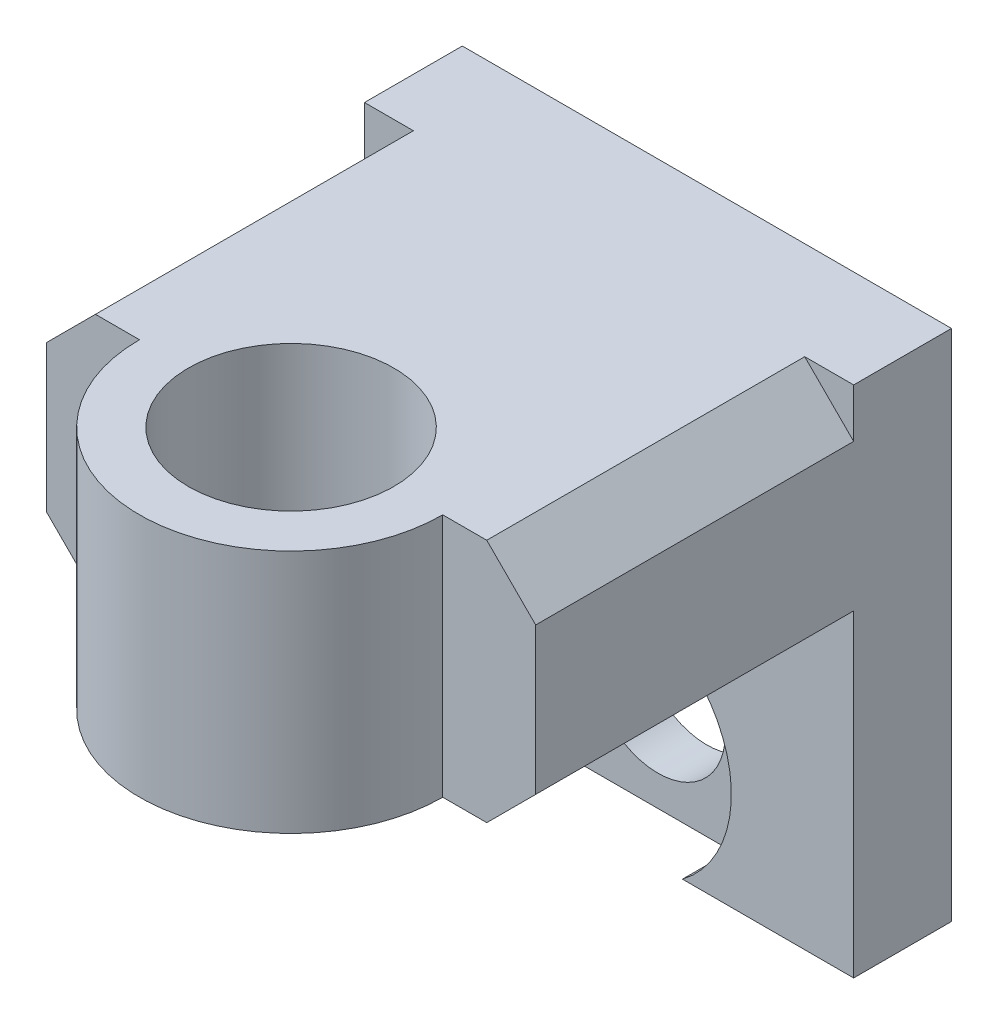
ISO-10303-21;
HEADER;
FILE_DESCRIPTION(('STEP AP214'),'2;1');
FILE_NAME('part.step','',(''),(''),'','','');
FILE_SCHEMA(('AUTOMOTIVE_DESIGN { 1 0 10303 214 1 1 1 1 }'));
ENDSEC;
DATA;
#1=APPLICATION_CONTEXT('core data for automotive mechanical design processes');
#2=APPLICATION_PROTOCOL_DEFINITION('international standard','automotive_design',2000,#1);
#3=PRODUCT_CONTEXT('',#1,'mechanical');
#4=PRODUCT('Part','Part','',(#3));
#5=PRODUCT_RELATED_PRODUCT_CATEGORY('part','',(#4));
#6=PRODUCT_DEFINITION_FORMATION('','',#4);
#7=PRODUCT_DEFINITION_CONTEXT('part definition',#1,'design');
#8=PRODUCT_DEFINITION('design','',#6,#7);
#9=PRODUCT_DEFINITION_SHAPE('','',#8);
#10=(LENGTH_UNIT() NAMED_UNIT(*) SI_UNIT(.MILLI.,.METRE.));
#11=(NAMED_UNIT(*) PLANE_ANGLE_UNIT() SI_UNIT($,.RADIAN.));
#12=(NAMED_UNIT(*) SI_UNIT($,.STERADIAN.) SOLID_ANGLE_UNIT());
#13=UNCERTAINTY_MEASURE_WITH_UNIT(LENGTH_MEASURE(1.E-05),#10,'distance_accuracy_value','');
#14=(GEOMETRIC_REPRESENTATION_CONTEXT(3) GLOBAL_UNCERTAINTY_ASSIGNED_CONTEXT((#13)) GLOBAL_UNIT_ASSIGNED_CONTEXT((#10,
#11,#12)) REPRESENTATION_CONTEXT('',''));
#15=CARTESIAN_POINT('',(0.,0.,0.));
#16=DIRECTION('',(0.,0.,1.));
#17=DIRECTION('',(1.,0.,0.));
#18=AXIS2_PLACEMENT_3D('',#15,#16,#17);
#19=CARTESIAN_POINT('',(0.,0.,4.));
#20=DIRECTION('',(0.,0.,1.));
#21=DIRECTION('',(1.,0.,0.));
#22=AXIS2_PLACEMENT_3D('',#19,#20,#21);
#23=PLANE('',#22);
#24=DIRECTION('',(1.,0.,0.));
#25=VECTOR('',#24,1.);
#26=CARTESIAN_POINT('',(0.,-11.,4.));
#27=LINE('',#26,#25);
#28=CARTESIAN_POINT('',(0.,-11.,4.));
#29=VERTEX_POINT('',#28);
#30=CARTESIAN_POINT('',(2.00000000000001,-11.,4.));
#31=VERTEX_POINT('',#30);
#32=EDGE_CURVE('E159',#29,#31,#27,.T.);
#33=ORIENTED_EDGE('',*,*,#32,.F.);
#34=DIRECTION('',(0.,-1.,0.));
#35=VECTOR('',#34,1.);
#36=CARTESIAN_POINT('',(0.,0.,4.));
#37=LINE('',#36,#35);
#38=CARTESIAN_POINT('',(0.,-13.,4.));
#39=VERTEX_POINT('',#38);
#40=EDGE_CURVE('E166',#29,#39,#37,.T.);
#41=ORIENTED_EDGE('',*,*,#40,.T.);
#42=DIRECTION('',(-0.707106781186549,-0.707106781186546,0.));
#43=VECTOR('',#42,1.);
#44=CARTESIAN_POINT('',(0.,-13.,4.));
#45=LINE('',#44,#43);
#46=EDGE_CURVE('E229',#39,#31,#45,.F.);
#47=ORIENTED_EDGE('',*,*,#46,.T.);
#48=EDGE_LOOP('',(#33,#41,#47));
#49=FACE_BOUND('',#48,.T.);
#50=ADVANCED_FACE('F35',(#49),#23,.T.);
#51=CARTESIAN_POINT('',(10.,-28.,4.));
#52=DIRECTION('',(0.,0.,-1.));
#53=DIRECTION('',(-1.,0.,0.));
#54=AXIS2_PLACEMENT_3D('',#51,#52,#53);
#55=CYLINDRICAL_SURFACE('',#54,2.75);
#56=CARTESIAN_POINT('',(10.,-28.,0.));
#57=DIRECTION('',(0.,0.,1.));
#58=DIRECTION('',(1.,0.,0.));
#59=AXIS2_PLACEMENT_3D('',#56,#57,#58);
#60=CIRCLE('',#59,2.75);
#61=CARTESIAN_POINT('',(12.75,-28.,0.));
#62=VERTEX_POINT('',#61);
#63=EDGE_CURVE('E172',#62,#62,#60,.T.);
#64=ORIENTED_EDGE('',*,*,#63,.F.);
#65=EDGE_LOOP('',(#64));
#66=FACE_BOUND('',#65,.T.);
#67=CARTESIAN_POINT('',(10.,-28.,2.));
#68=DIRECTION('',(0.,0.,1.));
#69=DIRECTION('',(1.,0.,0.));
#70=AXIS2_PLACEMENT_3D('',#67,#68,#69);
#71=CIRCLE('',#70,2.75);
#72=CARTESIAN_POINT('',(12.75,-28.,2.));
#73=VERTEX_POINT('',#72);
#74=EDGE_CURVE('E232',#73,#73,#71,.T.);
#75=ORIENTED_EDGE('',*,*,#74,.T.);
#76=EDGE_LOOP('',(#75));
#77=FACE_BOUND('',#76,.T.);
#78=ADVANCED_FACE('F332',(#66,#77),#55,.F.);
#79=CARTESIAN_POINT('',(0.,0.,17.));
#80=DIRECTION('',(0.,0.,1.));
#81=DIRECTION('',(1.,0.,0.));
#82=AXIS2_PLACEMENT_3D('',#79,#80,#81);
#83=PLANE('',#82);
#84=DIRECTION('',(0.,-1.,0.));
#85=VECTOR('',#84,1.);
#86=CARTESIAN_POINT('',(0.,-11.,17.));
#87=LINE('',#86,#85);
#88=CARTESIAN_POINT('',(0.,-13.,17.));
#89=VERTEX_POINT('',#88);
#90=CARTESIAN_POINT('',(0.,-19.,17.));
#91=VERTEX_POINT('',#90);
#92=EDGE_CURVE('E269',#89,#91,#87,.T.);
#93=ORIENTED_EDGE('',*,*,#92,.T.);
#94=DIRECTION('',(-0.707106781186549,0.707106781186546,0.));
#95=VECTOR('',#94,1.);
#96=CARTESIAN_POINT('',(-9.5,-9.50000000000003,17.));
#97=LINE('',#96,#95);
#98=CARTESIAN_POINT('',(2.00000000000001,-21.,17.));
#99=VERTEX_POINT('',#98);
#100=EDGE_CURVE('E220',#91,#99,#97,.F.);
#101=ORIENTED_EDGE('',*,*,#100,.T.);
#102=DIRECTION('',(1.,0.,0.));
#103=VECTOR('',#102,1.);
#104=CARTESIAN_POINT('',(0.,-21.,17.));
#105=LINE('',#104,#103);
#106=CARTESIAN_POINT('',(3.8,-21.,17.));
#107=VERTEX_POINT('',#106);
#108=EDGE_CURVE('E273',#99,#107,#105,.T.);
#109=ORIENTED_EDGE('',*,*,#108,.T.);
#110=DIRECTION('',(0.,-1.,0.));
#111=VECTOR('',#110,1.);
#112=CARTESIAN_POINT('',(3.8,6.53624817342637,17.));
#113=LINE('',#112,#111);
#114=CARTESIAN_POINT('',(3.8,-11.,17.));
#115=VERTEX_POINT('',#114);
#116=EDGE_CURVE('E192',#115,#107,#113,.T.);
#117=ORIENTED_EDGE('',*,*,#116,.F.);
#118=DIRECTION('',(-1.,0.,0.));
#119=VECTOR('',#118,1.);
#120=CARTESIAN_POINT('',(0.,-11.,17.));
#121=LINE('',#120,#119);
#122=CARTESIAN_POINT('',(2.00000000000001,-11.,17.));
#123=VERTEX_POINT('',#122);
#124=EDGE_CURVE('E278',#115,#123,#121,.T.);
#125=ORIENTED_EDGE('',*,*,#124,.T.);
#126=DIRECTION('',(0.707106781186549,0.707106781186546,0.));
#127=VECTOR('',#126,1.);
#128=CARTESIAN_POINT('',(6.5,-6.50000000000002,17.));
#129=LINE('',#128,#127);
#130=EDGE_CURVE('E218',#123,#89,#129,.F.);
#131=ORIENTED_EDGE('',*,*,#130,.T.);
#132=EDGE_LOOP('',(#93,#101,#109,#117,#125,#131));
#133=FACE_BOUND('',#132,.T.);
#134=ADVANCED_FACE('F323',(#133),#83,.T.);
#135=CARTESIAN_POINT('',(18.,-11.,4.));
#136=VERTEX_POINT('',#135);
#137=CARTESIAN_POINT('',(20.,-11.,4.));
#138=VERTEX_POINT('',#137);
#139=EDGE_CURVE('E305',#136,#138,#27,.T.);
#140=ORIENTED_EDGE('',*,*,#139,.F.);
#141=DIRECTION('',(-0.707106781186549,0.707106781186546,0.));
#142=VECTOR('',#141,1.);
#143=CARTESIAN_POINT('',(18.,-11.,4.));
#144=LINE('',#143,#142);
#145=CARTESIAN_POINT('',(20.,-13.,4.));
#146=VERTEX_POINT('',#145);
#147=EDGE_CURVE('E222',#136,#146,#144,.F.);
#148=ORIENTED_EDGE('',*,*,#147,.T.);
#149=DIRECTION('',(0.,1.,0.));
#150=VECTOR('',#149,1.);
#151=CARTESIAN_POINT('',(20.,0.,4.));
#152=LINE('',#151,#150);
#153=EDGE_CURVE('E282',#146,#138,#152,.T.);
#154=ORIENTED_EDGE('',*,*,#153,.T.);
#155=EDGE_LOOP('',(#140,#148,#154));
#156=FACE_BOUND('',#155,.T.);
#157=ADVANCED_FACE('F334',(#156),#23,.T.);
#158=CARTESIAN_POINT('',(10.,-28.,4.));
#159=DIRECTION('',(0.,0.,1.));
#160=DIRECTION('',(1.,0.,0.));
#161=AXIS2_PLACEMENT_3D('',#158,#159,#160);
#162=CIRCLE('',#161,5.);
#163=CARTESIAN_POINT('',(13.,-32.,4.));
#164=VERTEX_POINT('',#163);
#165=CARTESIAN_POINT('',(7.,-32.,4.));
#166=VERTEX_POINT('',#165);
#167=EDGE_CURVE('E245',#164,#166,#162,.T.);
#168=ORIENTED_EDGE('',*,*,#167,.F.);
#169=DIRECTION('',(1.,0.,0.));
#170=VECTOR('',#169,1.);
#171=CARTESIAN_POINT('',(0.,-32.,4.));
#172=LINE('',#171,#170);
#173=CARTESIAN_POINT('',(20.,-32.,4.));
#174=VERTEX_POINT('',#173);
#175=EDGE_CURVE('E241',#164,#174,#172,.T.);
#176=ORIENTED_EDGE('',*,*,#175,.T.);
#177=CARTESIAN_POINT('',(20.,-19.,4.));
#178=VERTEX_POINT('',#177);
#179=EDGE_CURVE('E180',#174,#178,#152,.T.);
#180=ORIENTED_EDGE('',*,*,#179,.T.);
#181=DIRECTION('',(0.707106781186545,0.70710678118655,0.));
#182=VECTOR('',#181,1.);
#183=CARTESIAN_POINT('',(20.,-19.,4.));
#184=LINE('',#183,#182);
#185=CARTESIAN_POINT('',(18.,-21.,4.));
#186=VERTEX_POINT('',#185);
#187=EDGE_CURVE('E225',#178,#186,#184,.F.);
#188=ORIENTED_EDGE('',*,*,#187,.T.);
#189=DIRECTION('',(1.,0.,0.));
#190=VECTOR('',#189,1.);
#191=CARTESIAN_POINT('',(0.,-21.,4.));
#192=LINE('',#191,#190);
#193=CARTESIAN_POINT('',(2.00000000000001,-21.,4.));
#194=VERTEX_POINT('',#193);
#195=EDGE_CURVE('E268',#194,#186,#192,.T.);
#196=ORIENTED_EDGE('',*,*,#195,.F.);
#197=DIRECTION('',(0.707106781186549,-0.707106781186546,0.));
#198=VECTOR('',#197,1.);
#199=CARTESIAN_POINT('',(2.00000000000001,-21.,4.));
#200=LINE('',#199,#198);
#201=CARTESIAN_POINT('',(0.,-19.,4.));
#202=VERTEX_POINT('',#201);
#203=EDGE_CURVE('E227',#194,#202,#200,.F.);
#204=ORIENTED_EDGE('',*,*,#203,.T.);
#205=CARTESIAN_POINT('',(0.,-32.,4.));
#206=VERTEX_POINT('',#205);
#207=EDGE_CURVE('E57',#202,#206,#37,.T.);
#208=ORIENTED_EDGE('',*,*,#207,.T.);
#209=EDGE_CURVE('E250',#206,#166,#172,.T.);
#210=ORIENTED_EDGE('',*,*,#209,.T.);
#211=EDGE_LOOP('',(#168,#176,#180,#188,#196,#204,#208,#210));
#212=FACE_BOUND('',#211,.T.);
#213=ADVANCED_FACE('F248',(#212),#23,.T.);
#214=CARTESIAN_POINT('',(0.,0.,0.));
#215=DIRECTION('',(0.,0.,1.));
#216=DIRECTION('',(1.,0.,0.));
#217=AXIS2_PLACEMENT_3D('',#214,#215,#216);
#218=PLANE('',#217);
#219=DIRECTION('',(0.,-1.,0.));
#220=VECTOR('',#219,1.);
#221=CARTESIAN_POINT('',(0.,0.,0.));
#222=LINE('',#221,#220);
#223=CARTESIAN_POINT('',(0.,-11.,0.));
#224=VERTEX_POINT('',#223);
#225=CARTESIAN_POINT('',(0.,-32.,0.));
#226=VERTEX_POINT('',#225);
#227=EDGE_CURVE('E163',#224,#226,#222,.T.);
#228=ORIENTED_EDGE('',*,*,#227,.F.);
#229=DIRECTION('',(1.,0.,0.));
#230=VECTOR('',#229,1.);
#231=CARTESIAN_POINT('',(0.,-11.,0.));
#232=LINE('',#231,#230);
#233=CARTESIAN_POINT('',(20.,-11.,0.));
#234=VERTEX_POINT('',#233);
#235=EDGE_CURVE('E147',#224,#234,#232,.T.);
#236=ORIENTED_EDGE('',*,*,#235,.T.);
#237=DIRECTION('',(0.,1.,0.));
#238=VECTOR('',#237,1.);
#239=CARTESIAN_POINT('',(20.,0.,0.));
#240=LINE('',#239,#238);
#241=CARTESIAN_POINT('',(20.,-32.,0.));
#242=VERTEX_POINT('',#241);
#243=EDGE_CURVE('E174',#242,#234,#240,.T.);
#244=ORIENTED_EDGE('',*,*,#243,.F.);
#245=DIRECTION('',(1.,0.,0.));
#246=VECTOR('',#245,1.);
#247=CARTESIAN_POINT('',(0.,-32.,0.));
#248=LINE('',#247,#246);
#249=EDGE_CURVE('E170',#226,#242,#248,.T.);
#250=ORIENTED_EDGE('',*,*,#249,.F.);
#251=EDGE_LOOP('',(#228,#236,#244,#250));
#252=FACE_BOUND('',#251,.T.);
#253=ORIENTED_EDGE('',*,*,#63,.T.);
#254=EDGE_LOOP('',(#253));
#255=FACE_BOUND('',#254,.T.);
#256=ADVANCED_FACE('F168',(#252,#255),#218,.F.);
#257=CARTESIAN_POINT('',(0.,0.,4.));
#258=DIRECTION('',(1.,0.,0.));
#259=DIRECTION('',(0.,0.,-1.));
#260=AXIS2_PLACEMENT_3D('',#257,#258,#259);
#261=PLANE('',#260);
#262=ORIENTED_EDGE('',*,*,#40,.F.);
#263=DIRECTION('',(0.,0.,1.));
#264=VECTOR('',#263,1.);
#265=CARTESIAN_POINT('',(0.,-11.,0.));
#266=LINE('',#265,#264);
#267=EDGE_CURVE('E151',#224,#29,#266,.T.);
#268=ORIENTED_EDGE('',*,*,#267,.F.);
#269=ORIENTED_EDGE('',*,*,#227,.T.);
#270=DIRECTION('',(0.,0.,-1.));
#271=VECTOR('',#270,1.);
#272=CARTESIAN_POINT('',(0.,-32.,4.));
#273=LINE('',#272,#271);
#274=EDGE_CURVE('E187',#206,#226,#273,.T.);
#275=ORIENTED_EDGE('',*,*,#274,.F.);
#276=ORIENTED_EDGE('',*,*,#207,.F.);
#277=DIRECTION('',(0.,0.,1.));
#278=VECTOR('',#277,1.);
#279=CARTESIAN_POINT('',(0.,-19.,4.));
#280=LINE('',#279,#278);
#281=EDGE_CURVE('E216',#202,#91,#280,.T.);
#282=ORIENTED_EDGE('',*,*,#281,.T.);
#283=ORIENTED_EDGE('',*,*,#92,.F.);
#284=DIRECTION('',(0.,0.,-1.));
#285=VECTOR('',#284,1.);
#286=CARTESIAN_POINT('',(0.,-13.,4.));
#287=LINE('',#286,#285);
#288=EDGE_CURVE('E214',#89,#39,#287,.T.);
#289=ORIENTED_EDGE('',*,*,#288,.T.);
#290=EDGE_LOOP('',(#262,#268,#269,#275,#276,#282,#283,#289));
#291=FACE_BOUND('',#290,.T.);
#292=ADVANCED_FACE('F162',(#291),#261,.F.);
#293=CARTESIAN_POINT('',(0.,-32.,4.));
#294=DIRECTION('',(0.,1.,0.));
#295=DIRECTION('',(0.,0.,1.));
#296=AXIS2_PLACEMENT_3D('',#293,#294,#295);
#297=PLANE('',#296);
#298=DIRECTION('',(1.,0.,0.));
#299=VECTOR('',#298,1.);
#300=CARTESIAN_POINT('',(0.,-32.,2.));
#301=LINE('',#300,#299);
#302=CARTESIAN_POINT('',(7.,-32.,2.));
#303=VERTEX_POINT('',#302);
#304=CARTESIAN_POINT('',(13.,-32.,2.));
#305=VERTEX_POINT('',#304);
#306=EDGE_CURVE('E234',#303,#305,#301,.T.);
#307=ORIENTED_EDGE('',*,*,#306,.F.);
#308=DIRECTION('',(0.,0.,1.));
#309=VECTOR('',#308,1.);
#310=CARTESIAN_POINT('',(7.,-32.,2.));
#311=LINE('',#310,#309);
#312=EDGE_CURVE('E11',#303,#166,#311,.T.);
#313=ORIENTED_EDGE('',*,*,#312,.T.);
#314=ORIENTED_EDGE('',*,*,#209,.F.);
#315=ORIENTED_EDGE('',*,*,#274,.T.);
#316=ORIENTED_EDGE('',*,*,#249,.T.);
#317=DIRECTION('',(0.,0.,-1.));
#318=VECTOR('',#317,1.);
#319=CARTESIAN_POINT('',(20.,-32.,4.));
#320=LINE('',#319,#318);
#321=EDGE_CURVE('E184',#174,#242,#320,.T.);
#322=ORIENTED_EDGE('',*,*,#321,.F.);
#323=ORIENTED_EDGE('',*,*,#175,.F.);
#324=DIRECTION('',(0.,0.,1.));
#325=VECTOR('',#324,1.);
#326=CARTESIAN_POINT('',(13.,-32.,2.));
#327=LINE('',#326,#325);
#328=EDGE_CURVE('E43',#164,#305,#327,.F.);
#329=ORIENTED_EDGE('',*,*,#328,.T.);
#330=EDGE_LOOP('',(#307,#313,#314,#315,#316,#322,#323,#329));
#331=FACE_BOUND('',#330,.T.);
#332=ADVANCED_FACE('F239',(#331),#297,.F.);
#333=CARTESIAN_POINT('',(20.,0.,4.));
#334=DIRECTION('',(-1.,0.,0.));
#335=DIRECTION('',(0.,0.,1.));
#336=AXIS2_PLACEMENT_3D('',#333,#334,#335);
#337=PLANE('',#336);
#338=ORIENTED_EDGE('',*,*,#243,.T.);
#339=DIRECTION('',(0.,0.,1.));
#340=VECTOR('',#339,1.);
#341=CARTESIAN_POINT('',(20.,-11.,0.));
#342=LINE('',#341,#340);
#343=EDGE_CURVE('E154',#234,#138,#342,.T.);
#344=ORIENTED_EDGE('',*,*,#343,.T.);
#345=ORIENTED_EDGE('',*,*,#153,.F.);
#346=DIRECTION('',(0.,0.,1.));
#347=VECTOR('',#346,1.);
#348=CARTESIAN_POINT('',(20.,-13.,4.));
#349=LINE('',#348,#347);
#350=CARTESIAN_POINT('',(20.,-13.,17.));
#351=VERTEX_POINT('',#350);
#352=EDGE_CURVE('E203',#146,#351,#349,.T.);
#353=ORIENTED_EDGE('',*,*,#352,.T.);
#354=DIRECTION('',(0.,1.,0.));
#355=VECTOR('',#354,1.);
#356=CARTESIAN_POINT('',(20.,-11.,17.));
#357=LINE('',#356,#355);
#358=CARTESIAN_POINT('',(20.,-19.,17.));
#359=VERTEX_POINT('',#358);
#360=EDGE_CURVE('E275',#359,#351,#357,.T.);
#361=ORIENTED_EDGE('',*,*,#360,.F.);
#362=DIRECTION('',(0.,0.,-1.));
#363=VECTOR('',#362,1.);
#364=CARTESIAN_POINT('',(20.,-19.,4.));
#365=LINE('',#364,#363);
#366=EDGE_CURVE('E200',#359,#178,#365,.T.);
#367=ORIENTED_EDGE('',*,*,#366,.T.);
#368=ORIENTED_EDGE('',*,*,#179,.F.);
#369=ORIENTED_EDGE('',*,*,#321,.T.);
#370=EDGE_LOOP('',(#338,#344,#345,#353,#361,#367,#368,#369));
#371=FACE_BOUND('',#370,.T.);
#372=ADVANCED_FACE('F295',(#371),#337,.F.);
#373=CARTESIAN_POINT('',(0.,-21.,17.));
#374=DIRECTION('',(0.,1.,0.));
#375=DIRECTION('',(0.,0.,1.));
#376=AXIS2_PLACEMENT_3D('',#373,#374,#375);
#377=PLANE('',#376);
#378=CARTESIAN_POINT('',(10.,-21.,17.));
#379=DIRECTION('',(0.,1.,0.));
#380=DIRECTION('',(0.,0.,1.));
#381=AXIS2_PLACEMENT_3D('',#378,#379,#380);
#382=CIRCLE('',#381,4.2);
#383=CARTESIAN_POINT('',(10.,-21.,21.2));
#384=VERTEX_POINT('',#383);
#385=EDGE_CURVE('E259',#384,#384,#382,.T.);
#386=ORIENTED_EDGE('',*,*,#385,.T.);
#387=EDGE_LOOP('',(#386));
#388=FACE_BOUND('',#387,.T.);
#389=ORIENTED_EDGE('',*,*,#195,.T.);
#390=DIRECTION('',(0.,0.,1.));
#391=VECTOR('',#390,1.);
#392=CARTESIAN_POINT('',(18.,-21.,17.));
#393=LINE('',#392,#391);
#394=CARTESIAN_POINT('',(18.,-21.,17.));
#395=VERTEX_POINT('',#394);
#396=EDGE_CURVE('E212',#186,#395,#393,.T.);
#397=ORIENTED_EDGE('',*,*,#396,.T.);
#398=CARTESIAN_POINT('',(16.2,-21.,17.));
#399=VERTEX_POINT('',#398);
#400=EDGE_CURVE('E272',#399,#395,#105,.T.);
#401=ORIENTED_EDGE('',*,*,#400,.F.);
#402=CARTESIAN_POINT('',(10.,-21.,17.));
#403=DIRECTION('',(0.,-1.,0.));
#404=DIRECTION('',(0.,0.,-1.));
#405=AXIS2_PLACEMENT_3D('',#402,#403,#404);
#406=CIRCLE('',#405,6.2);
#407=EDGE_CURVE('E262',#399,#107,#406,.T.);
#408=ORIENTED_EDGE('',*,*,#407,.T.);
#409=ORIENTED_EDGE('',*,*,#108,.F.);
#410=DIRECTION('',(0.,0.,-1.));
#411=VECTOR('',#410,1.);
#412=CARTESIAN_POINT('',(2.00000000000001,-21.,17.));
#413=LINE('',#412,#411);
#414=EDGE_CURVE('E209',#99,#194,#413,.T.);
#415=ORIENTED_EDGE('',*,*,#414,.T.);
#416=EDGE_LOOP('',(#389,#397,#401,#408,#409,#415));
#417=FACE_BOUND('',#416,.T.);
#418=ADVANCED_FACE('F314',(#388,#417),#377,.F.);
#419=CARTESIAN_POINT('',(0.,-11.,17.));
#420=DIRECTION('',(0.,-1.,0.));
#421=DIRECTION('',(0.,0.,-1.));
#422=AXIS2_PLACEMENT_3D('',#419,#420,#421);
#423=PLANE('',#422);
#424=CARTESIAN_POINT('',(10.,-11.,17.));
#425=DIRECTION('',(0.,1.,0.));
#426=DIRECTION('',(0.,0.,1.));
#427=AXIS2_PLACEMENT_3D('',#424,#425,#426);
#428=CIRCLE('',#427,4.2);
#429=CARTESIAN_POINT('',(10.,-11.,21.2));
#430=VERTEX_POINT('',#429);
#431=EDGE_CURVE('E256',#430,#430,#428,.T.);
#432=ORIENTED_EDGE('',*,*,#431,.F.);
#433=EDGE_LOOP('',(#432));
#434=FACE_BOUND('',#433,.T.);
#435=CARTESIAN_POINT('',(18.,-11.,17.));
#436=VERTEX_POINT('',#435);
#437=CARTESIAN_POINT('',(16.2,-11.,17.));
#438=VERTEX_POINT('',#437);
#439=EDGE_CURVE('E177',#436,#438,#121,.T.);
#440=ORIENTED_EDGE('',*,*,#439,.F.);
#441=DIRECTION('',(0.,0.,-1.));
#442=VECTOR('',#441,1.);
#443=CARTESIAN_POINT('',(18.,-11.,17.));
#444=LINE('',#443,#442);
#445=EDGE_CURVE('E197',#436,#136,#444,.T.);
#446=ORIENTED_EDGE('',*,*,#445,.T.);
#447=ORIENTED_EDGE('',*,*,#139,.T.);
#448=ORIENTED_EDGE('',*,*,#343,.F.);
#449=ORIENTED_EDGE('',*,*,#235,.F.);
#450=ORIENTED_EDGE('',*,*,#267,.T.);
#451=ORIENTED_EDGE('',*,*,#32,.T.);
#452=DIRECTION('',(0.,0.,1.));
#453=VECTOR('',#452,1.);
#454=CARTESIAN_POINT('',(2.00000000000001,-11.,17.));
#455=LINE('',#454,#453);
#456=EDGE_CURVE('E195',#31,#123,#455,.T.);
#457=ORIENTED_EDGE('',*,*,#456,.T.);
#458=ORIENTED_EDGE('',*,*,#124,.F.);
#459=CARTESIAN_POINT('',(10.,-11.,17.));
#460=DIRECTION('',(0.,-1.,0.));
#461=DIRECTION('',(0.,0.,-1.));
#462=AXIS2_PLACEMENT_3D('',#459,#460,#461);
#463=CIRCLE('',#462,6.2);
#464=EDGE_CURVE('E265',#115,#438,#463,.F.);
#465=ORIENTED_EDGE('',*,*,#464,.T.);
#466=EDGE_LOOP('',(#440,#446,#447,#448,#449,#450,#451,#457,#458,#465));
#467=FACE_BOUND('',#466,.T.);
#468=ADVANCED_FACE('F150',(#434,#467),#423,.F.);
#469=ORIENTED_EDGE('',*,*,#360,.T.);
#470=DIRECTION('',(0.707106781186549,-0.707106781186546,0.));
#471=VECTOR('',#470,1.);
#472=CARTESIAN_POINT('',(3.49999999999997,3.49999999999998,17.));
#473=LINE('',#472,#471);
#474=EDGE_CURVE('E207',#351,#436,#473,.F.);
#475=ORIENTED_EDGE('',*,*,#474,.T.);
#476=ORIENTED_EDGE('',*,*,#439,.T.);
#477=DIRECTION('',(0.,-1.,0.));
#478=VECTOR('',#477,1.);
#479=CARTESIAN_POINT('',(16.2,6.53624817342637,17.));
#480=LINE('',#479,#478);
#481=EDGE_CURVE('E189',#399,#438,#480,.F.);
#482=ORIENTED_EDGE('',*,*,#481,.F.);
#483=ORIENTED_EDGE('',*,*,#400,.T.);
#484=DIRECTION('',(-0.707106781186545,-0.70710678118655,0.));
#485=VECTOR('',#484,1.);
#486=CARTESIAN_POINT('',(19.5000000000001,-19.4999999999999,17.));
#487=LINE('',#486,#485);
#488=EDGE_CURVE('E205',#395,#359,#487,.F.);
#489=ORIENTED_EDGE('',*,*,#488,.T.);
#490=EDGE_LOOP('',(#469,#475,#476,#482,#483,#489));
#491=FACE_BOUND('',#490,.T.);
#492=ADVANCED_FACE('F299',(#491),#83,.T.);
#493=CARTESIAN_POINT('',(10.,6.53624817342637,17.));
#494=DIRECTION('',(0.,-1.,0.));
#495=DIRECTION('',(0.,0.,-1.));
#496=AXIS2_PLACEMENT_3D('',#493,#494,#495);
#497=CYLINDRICAL_SURFACE('',#496,6.2);
#498=ORIENTED_EDGE('',*,*,#464,.F.);
#499=ORIENTED_EDGE('',*,*,#116,.T.);
#500=ORIENTED_EDGE('',*,*,#407,.F.);
#501=ORIENTED_EDGE('',*,*,#481,.T.);
#502=EDGE_LOOP('',(#498,#499,#500,#501));
#503=FACE_BOUND('',#502,.T.);
#504=ADVANCED_FACE('F310',(#503),#497,.T.);
#505=CARTESIAN_POINT('',(10.,-24.,17.));
#506=DIRECTION('',(0.,1.,0.));
#507=DIRECTION('',(0.,0.,1.));
#508=AXIS2_PLACEMENT_3D('',#505,#506,#507);
#509=CYLINDRICAL_SURFACE('',#508,4.2);
#510=CARTESIAN_POINT('',(10.,-11.,21.2));
#511=CARTESIAN_POINT('',(10.,-11.1041666666667,21.2));
#512=CARTESIAN_POINT('',(10.,-11.2083333333333,21.2));
#513=CARTESIAN_POINT('',(10.,-11.4166666666667,21.2));
#514=CARTESIAN_POINT('',(10.,-11.5208333333333,21.2));
#515=CARTESIAN_POINT('',(10.,-11.7291666666667,21.2));
#516=CARTESIAN_POINT('',(10.,-11.8333333333333,21.2));
#517=CARTESIAN_POINT('',(10.,-12.0416666666667,21.2));
#518=CARTESIAN_POINT('',(10.,-12.1458333333333,21.2));
#519=CARTESIAN_POINT('',(10.,-12.3541666666667,21.2));
#520=CARTESIAN_POINT('',(10.,-12.4583333333333,21.2));
#521=CARTESIAN_POINT('',(10.,-12.6666666666667,21.2));
#522=CARTESIAN_POINT('',(10.,-12.7708333333333,21.2));
#523=CARTESIAN_POINT('',(10.,-12.9791666666667,21.2));
#524=CARTESIAN_POINT('',(10.,-13.0833333333333,21.2));
#525=CARTESIAN_POINT('',(10.,-13.2916666666667,21.2));
#526=CARTESIAN_POINT('',(10.,-13.3958333333333,21.2));
#527=CARTESIAN_POINT('',(10.,-13.6041666666667,21.2));
#528=CARTESIAN_POINT('',(10.,-13.7083333333333,21.2));
#529=CARTESIAN_POINT('',(10.,-13.9166666666667,21.2));
#530=CARTESIAN_POINT('',(10.,-14.0208333333333,21.2));
#531=CARTESIAN_POINT('',(10.,-14.2291666666667,21.2));
#532=CARTESIAN_POINT('',(10.,-14.3333333333333,21.2));
#533=CARTESIAN_POINT('',(10.,-14.5416666666667,21.2));
#534=CARTESIAN_POINT('',(10.,-14.6458333333333,21.2));
#535=CARTESIAN_POINT('',(10.,-14.8541666666667,21.2));
#536=CARTESIAN_POINT('',(10.,-14.9583333333333,21.2));
#537=CARTESIAN_POINT('',(10.,-15.1666666666667,21.2));
#538=CARTESIAN_POINT('',(10.,-15.2708333333333,21.2));
#539=CARTESIAN_POINT('',(10.,-15.4791666666667,21.2));
#540=CARTESIAN_POINT('',(10.,-15.5833333333333,21.2));
#541=CARTESIAN_POINT('',(10.,-15.7916666666667,21.2));
#542=CARTESIAN_POINT('',(10.,-15.8958333333333,21.2));
#543=CARTESIAN_POINT('',(10.,-16.1041666666667,21.2));
#544=CARTESIAN_POINT('',(10.,-16.2083333333333,21.2));
#545=CARTESIAN_POINT('',(10.,-16.4166666666667,21.2));
#546=CARTESIAN_POINT('',(10.,-16.5208333333333,21.2));
#547=CARTESIAN_POINT('',(10.,-16.7291666666667,21.2));
#548=CARTESIAN_POINT('',(10.,-16.8333333333333,21.2));
#549=CARTESIAN_POINT('',(10.,-17.0416666666667,21.2));
#550=CARTESIAN_POINT('',(10.,-17.1458333333333,21.2));
#551=CARTESIAN_POINT('',(10.,-17.3541666666667,21.2));
#552=CARTESIAN_POINT('',(10.,-17.4583333333333,21.2));
#553=CARTESIAN_POINT('',(10.,-17.6666666666667,21.2));
#554=CARTESIAN_POINT('',(10.,-17.7708333333333,21.2));
#555=CARTESIAN_POINT('',(10.,-17.9791666666667,21.2));
#556=CARTESIAN_POINT('',(10.,-18.0833333333333,21.2));
#557=CARTESIAN_POINT('',(10.,-18.2916666666667,21.2));
#558=CARTESIAN_POINT('',(10.,-18.3958333333333,21.2));
#559=CARTESIAN_POINT('',(10.,-18.6041666666667,21.2));
#560=CARTESIAN_POINT('',(10.,-18.7083333333333,21.2));
#561=CARTESIAN_POINT('',(10.,-18.9166666666667,21.2));
#562=CARTESIAN_POINT('',(10.,-19.0208333333333,21.2));
#563=CARTESIAN_POINT('',(10.,-19.2291666666667,21.2));
#564=CARTESIAN_POINT('',(10.,-19.3333333333333,21.2));
#565=CARTESIAN_POINT('',(10.,-19.5416666666667,21.2));
#566=CARTESIAN_POINT('',(10.,-19.6458333333333,21.2));
#567=CARTESIAN_POINT('',(10.,-19.8541666666667,21.2));
#568=CARTESIAN_POINT('',(10.,-19.9583333333333,21.2));
#569=CARTESIAN_POINT('',(10.,-20.1666666666667,21.2));
#570=CARTESIAN_POINT('',(10.,-20.2708333333333,21.2));
#571=CARTESIAN_POINT('',(10.,-20.4791666666667,21.2));
#572=CARTESIAN_POINT('',(10.,-20.5833333333333,21.2));
#573=CARTESIAN_POINT('',(10.,-20.7916666666667,21.2));
#574=CARTESIAN_POINT('',(10.,-20.8958333333333,21.2));
#575=CARTESIAN_POINT('',(10.,-21.,21.2));
#576=B_SPLINE_CURVE_WITH_KNOTS('',3,(#510,#511,#512,#513,#514,#515,#516,#517,#518,#519,#520,
#521,#522,#523,#524,#525,#526,#527,#528,#529,#530,#531,#532,#533,#534,#535,#536,#537,#538,#539,
#540,#541,#542,#543,#544,#545,#546,#547,#548,#549,#550,#551,#552,#553,#554,#555,#556,#557,#558,
#559,#560,#561,#562,#563,#564,#565,#566,#567,#568,#569,#570,#571,#572,#573,#574,#575),
.UNSPECIFIED.,.F.,.F.,(4,2,2,2,2,2,2,2,2,2,2,2,2,2,2,2,2,2,2,2,2,2,2,2,2,2,2,2,2,2,2,2,4),(0.,
0.3125,0.625000000000001,0.937500000000001,1.25,1.5625,1.875,2.1875,2.5,2.8125,3.125,3.4375,
3.75,4.0625,4.375,4.6875,5.,5.3125,5.625,5.9375,6.25,6.5625,6.875,7.1875,7.5,7.8125,8.125,
8.4375,8.75,9.0625,9.375,9.6875,10.),.UNSPECIFIED.);
#577=EDGE_CURVE('BSEAM359',#430,#384,#576,.T.);
#578=ORIENTED_EDGE('',*,*,#431,.T.);
#579=ORIENTED_EDGE('',*,*,#385,.F.);
#580=ORIENTED_EDGE('',*,*,#577,.T.);
#581=ORIENTED_EDGE('',*,*,#577,.F.);
#582=EDGE_LOOP('',(#578,#580,#579,#581));
#583=FACE_BOUND('',#582,.T.);
#584=ADVANCED_FACE('F359',(#583),#509,.F.);
#585=CARTESIAN_POINT('',(18.,-11.,17.));
#586=DIRECTION('',(-0.707106781186546,-0.707106781186549,0.));
#587=DIRECTION('',(0.,0.,-1.));
#588=AXIS2_PLACEMENT_3D('',#585,#586,#587);
#589=PLANE('',#588);
#590=ORIENTED_EDGE('',*,*,#474,.F.);
#591=ORIENTED_EDGE('',*,*,#352,.F.);
#592=ORIENTED_EDGE('',*,*,#147,.F.);
#593=ORIENTED_EDGE('',*,*,#445,.F.);
#594=EDGE_LOOP('',(#590,#591,#592,#593));
#595=FACE_BOUND('',#594,.T.);
#596=ADVANCED_FACE('F303',(#595),#589,.F.);
#597=CARTESIAN_POINT('',(20.,-19.,4.));
#598=DIRECTION('',(-0.70710678118655,0.707106781186545,0.));
#599=DIRECTION('',(0.,0.,-1.));
#600=AXIS2_PLACEMENT_3D('',#597,#598,#599);
#601=PLANE('',#600);
#602=ORIENTED_EDGE('',*,*,#488,.F.);
#603=ORIENTED_EDGE('',*,*,#396,.F.);
#604=ORIENTED_EDGE('',*,*,#187,.F.);
#605=ORIENTED_EDGE('',*,*,#366,.F.);
#606=EDGE_LOOP('',(#602,#603,#604,#605));
#607=FACE_BOUND('',#606,.T.);
#608=ADVANCED_FACE('F293',(#607),#601,.F.);
#609=CARTESIAN_POINT('',(2.00000000000001,-21.,17.));
#610=DIRECTION('',(0.707106781186546,0.707106781186549,0.));
#611=DIRECTION('',(0.,0.,-1.));
#612=AXIS2_PLACEMENT_3D('',#609,#610,#611);
#613=PLANE('',#612);
#614=ORIENTED_EDGE('',*,*,#100,.F.);
#615=ORIENTED_EDGE('',*,*,#281,.F.);
#616=ORIENTED_EDGE('',*,*,#203,.F.);
#617=ORIENTED_EDGE('',*,*,#414,.F.);
#618=EDGE_LOOP('',(#614,#615,#616,#617));
#619=FACE_BOUND('',#618,.T.);
#620=ADVANCED_FACE('F319',(#619),#613,.F.);
#621=CARTESIAN_POINT('',(0.,-13.,4.));
#622=DIRECTION('',(0.707106781186546,-0.707106781186549,0.));
#623=DIRECTION('',(0.,0.,-1.));
#624=AXIS2_PLACEMENT_3D('',#621,#622,#623);
#625=PLANE('',#624);
#626=ORIENTED_EDGE('',*,*,#130,.F.);
#627=ORIENTED_EDGE('',*,*,#456,.F.);
#628=ORIENTED_EDGE('',*,*,#46,.F.);
#629=ORIENTED_EDGE('',*,*,#288,.F.);
#630=EDGE_LOOP('',(#626,#627,#628,#629));
#631=FACE_BOUND('',#630,.T.);
#632=ADVANCED_FACE('F37',(#631),#625,.F.);
#633=CARTESIAN_POINT('',(10.,-28.,2.));
#634=DIRECTION('',(0.,0.,1.));
#635=DIRECTION('',(1.,0.,0.));
#636=AXIS2_PLACEMENT_3D('',#633,#634,#635);
#637=CYLINDRICAL_SURFACE('',#636,5.);
#638=CARTESIAN_POINT('',(10.,-28.,2.));
#639=DIRECTION('',(0.,0.,1.));
#640=DIRECTION('',(1.,0.,0.));
#641=AXIS2_PLACEMENT_3D('',#638,#639,#640);
#642=CIRCLE('',#641,5.);
#643=EDGE_CURVE('E49',#305,#303,#642,.T.);
#644=ORIENTED_EDGE('',*,*,#643,.F.);
#645=ORIENTED_EDGE('',*,*,#328,.F.);
#646=ORIENTED_EDGE('',*,*,#167,.T.);
#647=ORIENTED_EDGE('',*,*,#312,.F.);
#648=EDGE_LOOP('',(#644,#645,#646,#647));
#649=FACE_BOUND('',#648,.T.);
#650=ADVANCED_FACE('F244',(#649),#637,.F.);
#651=CARTESIAN_POINT('',(10.,-28.,2.));
#652=DIRECTION('',(0.,0.,1.));
#653=DIRECTION('',(1.,0.,0.));
#654=AXIS2_PLACEMENT_3D('',#651,#652,#653);
#655=PLANE('',#654);
#656=ORIENTED_EDGE('',*,*,#74,.F.);
#657=EDGE_LOOP('',(#656));
#658=FACE_BOUND('',#657,.T.);
#659=ORIENTED_EDGE('',*,*,#306,.T.);
#660=ORIENTED_EDGE('',*,*,#643,.T.);
#661=EDGE_LOOP('',(#659,#660));
#662=FACE_BOUND('',#661,.T.);
#663=ADVANCED_FACE('F368',(#658,#662),#655,.T.);
#664=CLOSED_SHELL('',(#50,#78,#134,#157,#213,#256,#292,#332,#372,#418,#468,#492,#504,#584,#596,
#608,#620,#632,#650,#663));
#665=MANIFOLD_SOLID_BREP('B2',#664);
#666=ADVANCED_BREP_SHAPE_REPRESENTATION('',(#18,#665),#14);
#667=SHAPE_DEFINITION_REPRESENTATION(#9,#666);
ENDSEC;
END-ISO-10303-21;
